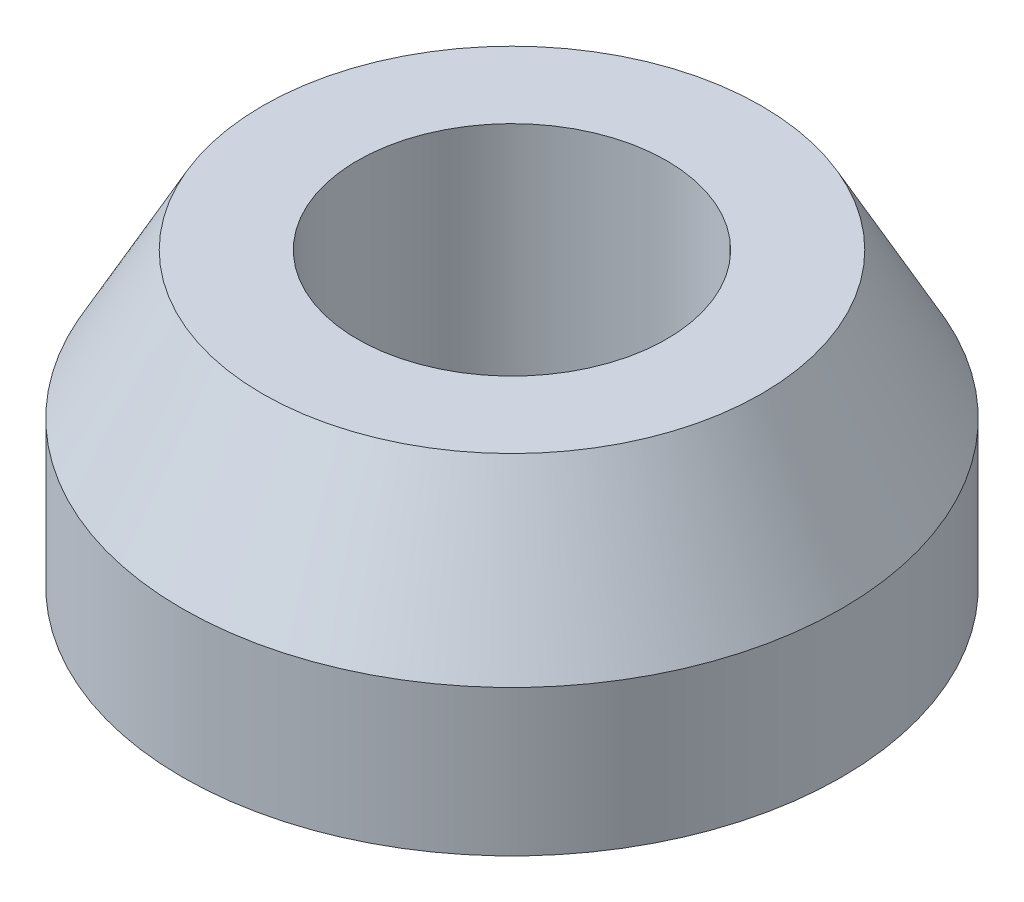
ISO-10303-21;
HEADER;
FILE_DESCRIPTION(('STEP AP214'),'2;1');
FILE_NAME('part.step','',(''),(''),'','','');
FILE_SCHEMA(('AUTOMOTIVE_DESIGN { 1 0 10303 214 1 1 1 1 }'));
ENDSEC;
DATA;
#1=APPLICATION_CONTEXT('core data for automotive mechanical design processes');
#2=APPLICATION_PROTOCOL_DEFINITION('international standard','automotive_design',2000,#1);
#3=PRODUCT_CONTEXT('',#1,'mechanical');
#4=PRODUCT('Part','Part','',(#3));
#5=PRODUCT_RELATED_PRODUCT_CATEGORY('part','',(#4));
#6=PRODUCT_DEFINITION_FORMATION('','',#4);
#7=PRODUCT_DEFINITION_CONTEXT('part definition',#1,'design');
#8=PRODUCT_DEFINITION('design','',#6,#7);
#9=PRODUCT_DEFINITION_SHAPE('','',#8);
#10=(LENGTH_UNIT() NAMED_UNIT(*) SI_UNIT(.MILLI.,.METRE.));
#11=(NAMED_UNIT(*) PLANE_ANGLE_UNIT() SI_UNIT($,.RADIAN.));
#12=(NAMED_UNIT(*) SI_UNIT($,.STERADIAN.) SOLID_ANGLE_UNIT());
#13=UNCERTAINTY_MEASURE_WITH_UNIT(LENGTH_MEASURE(1.E-05),#10,'distance_accuracy_value','');
#14=(GEOMETRIC_REPRESENTATION_CONTEXT(3) GLOBAL_UNCERTAINTY_ASSIGNED_CONTEXT((#13)) GLOBAL_UNIT_ASSIGNED_CONTEXT((#10,
#11,#12)) REPRESENTATION_CONTEXT('',''));
#15=CARTESIAN_POINT('',(0.,0.,0.));
#16=DIRECTION('',(0.,0.,1.));
#17=DIRECTION('',(1.,0.,0.));
#18=AXIS2_PLACEMENT_3D('',#15,#16,#17);
#19=CARTESIAN_POINT('',(0.,0.,0.));
#20=DIRECTION('',(0.,-1.,0.));
#21=DIRECTION('',(0.,0.,-1.));
#22=AXIS2_PLACEMENT_3D('',#19,#20,#21);
#23=CYLINDRICAL_SURFACE('',#22,6.731);
#24=CARTESIAN_POINT('',(0.,0.,0.));
#25=DIRECTION('',(0.,-1.,0.));
#26=DIRECTION('',(0.,0.,-1.));
#27=AXIS2_PLACEMENT_3D('',#24,#25,#26);
#28=CIRCLE('',#27,6.731);
#29=CARTESIAN_POINT('',(0.,0.,-6.731));
#30=VERTEX_POINT('',#29);
#31=EDGE_CURVE('E49',#30,#30,#28,.T.);
#32=ORIENTED_EDGE('',*,*,#31,.T.);
#33=EDGE_LOOP('',(#32));
#34=FACE_BOUND('',#33,.T.);
#35=CARTESIAN_POINT('',(0.,12.7,0.));
#36=DIRECTION('',(0.,-1.,0.));
#37=DIRECTION('',(0.,0.,-1.));
#38=AXIS2_PLACEMENT_3D('',#35,#36,#37);
#39=CIRCLE('',#38,6.731);
#40=CARTESIAN_POINT('',(0.,12.7,-6.731));
#41=VERTEX_POINT('',#40);
#42=EDGE_CURVE('E10',#41,#41,#39,.T.);
#43=ORIENTED_EDGE('',*,*,#42,.F.);
#44=EDGE_LOOP('',(#43));
#45=FACE_BOUND('',#44,.T.);
#46=ADVANCED_FACE('F30',(#34,#45),#23,.F.);
#47=CARTESIAN_POINT('',(6.731,12.7,0.));
#48=DIRECTION('',(0.,1.,0.));
#49=DIRECTION('',(0.,0.,1.));
#50=AXIS2_PLACEMENT_3D('',#47,#48,#49);
#51=PLANE('',#50);
#52=ORIENTED_EDGE('',*,*,#42,.T.);
#53=EDGE_LOOP('',(#52));
#54=FACE_BOUND('',#53,.T.);
#55=CARTESIAN_POINT('',(0.,12.7,0.));
#56=DIRECTION('',(0.,-1.,0.));
#57=DIRECTION('',(0.,0.,-1.));
#58=AXIS2_PLACEMENT_3D('',#55,#56,#57);
#59=CIRCLE('',#58,10.8585);
#60=CARTESIAN_POINT('',(0.,12.7,-10.8585));
#61=VERTEX_POINT('',#60);
#62=EDGE_CURVE('E36',#61,#61,#59,.T.);
#63=ORIENTED_EDGE('',*,*,#62,.F.);
#64=EDGE_LOOP('',(#63));
#65=FACE_BOUND('',#64,.T.);
#66=ADVANCED_FACE('F67',(#54,#65),#51,.T.);
#67=CARTESIAN_POINT('',(0.,6.35,0.));
#68=DIRECTION('',(0.,-1.,0.));
#69=DIRECTION('',(0.,0.,-1.));
#70=AXIS2_PLACEMENT_3D('',#67,#68,#69);
#71=CONICAL_SURFACE('',#70,14.351,0.502843210927861);
#72=ORIENTED_EDGE('',*,*,#62,.T.);
#73=EDGE_LOOP('',(#72));
#74=FACE_BOUND('',#73,.T.);
#75=CARTESIAN_POINT('',(0.,6.35,0.));
#76=DIRECTION('',(0.,-1.,0.));
#77=DIRECTION('',(0.,0.,-1.));
#78=AXIS2_PLACEMENT_3D('',#75,#76,#77);
#79=CIRCLE('',#78,14.351);
#80=CARTESIAN_POINT('',(0.,6.35,-14.351));
#81=VERTEX_POINT('',#80);
#82=EDGE_CURVE('E40',#81,#81,#79,.T.);
#83=ORIENTED_EDGE('',*,*,#82,.F.);
#84=EDGE_LOOP('',(#83));
#85=FACE_BOUND('',#84,.T.);
#86=ADVANCED_FACE('F63',(#74,#85),#71,.T.);
#87=CARTESIAN_POINT('',(0.,0.,0.));
#88=DIRECTION('',(0.,-1.,0.));
#89=DIRECTION('',(0.,0.,-1.));
#90=AXIS2_PLACEMENT_3D('',#87,#88,#89);
#91=CYLINDRICAL_SURFACE('',#90,14.351);
#92=ORIENTED_EDGE('',*,*,#82,.T.);
#93=EDGE_LOOP('',(#92));
#94=FACE_BOUND('',#93,.T.);
#95=CARTESIAN_POINT('',(0.,0.,0.));
#96=DIRECTION('',(0.,-1.,0.));
#97=DIRECTION('',(0.,0.,-1.));
#98=AXIS2_PLACEMENT_3D('',#95,#96,#97);
#99=CIRCLE('',#98,14.351);
#100=CARTESIAN_POINT('',(0.,0.,-14.351));
#101=VERTEX_POINT('',#100);
#102=EDGE_CURVE('E44',#101,#101,#99,.T.);
#103=ORIENTED_EDGE('',*,*,#102,.F.);
#104=EDGE_LOOP('',(#103));
#105=FACE_BOUND('',#104,.T.);
#106=ADVANCED_FACE('F57',(#94,#105),#91,.T.);
#107=CARTESIAN_POINT('',(6.731,0.,0.));
#108=DIRECTION('',(0.,-1.,0.));
#109=DIRECTION('',(0.,0.,-1.));
#110=AXIS2_PLACEMENT_3D('',#107,#108,#109);
#111=PLANE('',#110);
#112=ORIENTED_EDGE('',*,*,#102,.T.);
#113=EDGE_LOOP('',(#112));
#114=FACE_BOUND('',#113,.T.);
#115=ORIENTED_EDGE('',*,*,#31,.F.);
#116=EDGE_LOOP('',(#115));
#117=FACE_BOUND('',#116,.T.);
#118=ADVANCED_FACE('F55',(#114,#117),#111,.T.);
#119=CLOSED_SHELL('',(#46,#66,#86,#106,#118));
#120=MANIFOLD_SOLID_BREP('B2',#119);
#121=ADVANCED_BREP_SHAPE_REPRESENTATION('',(#18,#120),#14);
#122=SHAPE_DEFINITION_REPRESENTATION(#9,#121);
ENDSEC;
END-ISO-10303-21;
